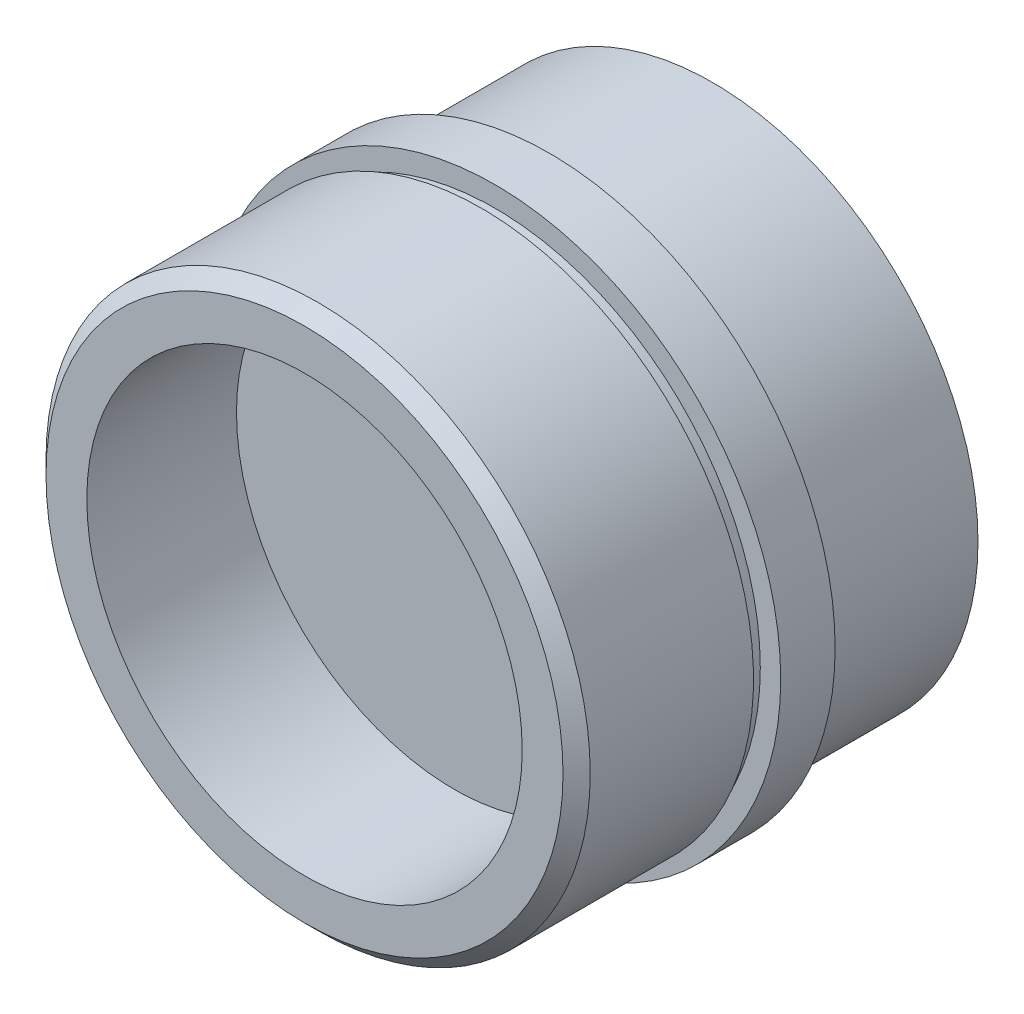
ISO-10303-21;
HEADER;
FILE_DESCRIPTION(('STEP AP214'),'2;1');
FILE_NAME('part.step','',(''),(''),'','','');
FILE_SCHEMA(('AUTOMOTIVE_DESIGN { 1 0 10303 214 1 1 1 1 }'));
ENDSEC;
DATA;
#1=APPLICATION_CONTEXT('core data for automotive mechanical design processes');
#2=APPLICATION_PROTOCOL_DEFINITION('international standard','automotive_design',2000,#1);
#3=PRODUCT_CONTEXT('',#1,'mechanical');
#4=PRODUCT('Part','Part','',(#3));
#5=PRODUCT_RELATED_PRODUCT_CATEGORY('part','',(#4));
#6=PRODUCT_DEFINITION_FORMATION('','',#4);
#7=PRODUCT_DEFINITION_CONTEXT('part definition',#1,'design');
#8=PRODUCT_DEFINITION('design','',#6,#7);
#9=PRODUCT_DEFINITION_SHAPE('','',#8);
#10=(LENGTH_UNIT() NAMED_UNIT(*) SI_UNIT(.MILLI.,.METRE.));
#11=(NAMED_UNIT(*) PLANE_ANGLE_UNIT() SI_UNIT($,.RADIAN.));
#12=(NAMED_UNIT(*) SI_UNIT($,.STERADIAN.) SOLID_ANGLE_UNIT());
#13=UNCERTAINTY_MEASURE_WITH_UNIT(LENGTH_MEASURE(1.E-05),#10,'distance_accuracy_value','');
#14=(GEOMETRIC_REPRESENTATION_CONTEXT(3) GLOBAL_UNCERTAINTY_ASSIGNED_CONTEXT((#13)) GLOBAL_UNIT_ASSIGNED_CONTEXT((#10,
#11,#12)) REPRESENTATION_CONTEXT('',''));
#15=CARTESIAN_POINT('',(0.,0.,0.));
#16=DIRECTION('',(0.,0.,1.));
#17=DIRECTION('',(1.,0.,0.));
#18=AXIS2_PLACEMENT_3D('',#15,#16,#17);
#19=CARTESIAN_POINT('',(0.,0.,16.));
#20=DIRECTION('',(0.,0.,1.));
#21=DIRECTION('',(1.,0.,0.));
#22=AXIS2_PLACEMENT_3D('',#19,#20,#21);
#23=PLANE('',#22);
#24=CARTESIAN_POINT('',(0.,0.,16.));
#25=DIRECTION('',(0.,0.,1.));
#26=DIRECTION('',(1.,0.,0.));
#27=AXIS2_PLACEMENT_3D('',#24,#25,#26);
#28=CIRCLE('',#27,21.);
#29=CARTESIAN_POINT('',(21.,0.,16.));
#30=VERTEX_POINT('',#29);
#31=EDGE_CURVE('E61',#30,#30,#28,.T.);
#32=ORIENTED_EDGE('',*,*,#31,.T.);
#33=EDGE_LOOP('',(#32));
#34=FACE_BOUND('',#33,.T.);
#35=CARTESIAN_POINT('',(0.,0.,16.));
#36=DIRECTION('',(0.,0.,-1.));
#37=DIRECTION('',(-1.,0.,0.));
#38=AXIS2_PLACEMENT_3D('',#35,#36,#37);
#39=CIRCLE('',#38,19.5);
#40=CARTESIAN_POINT('',(-19.5,0.,16.));
#41=VERTEX_POINT('',#40);
#42=EDGE_CURVE('E74',#41,#41,#39,.T.);
#43=ORIENTED_EDGE('',*,*,#42,.T.);
#44=EDGE_LOOP('',(#43));
#45=FACE_BOUND('',#44,.T.);
#46=ADVANCED_FACE('F30',(#34,#45),#23,.T.);
#47=CARTESIAN_POINT('',(0.,0.,0.));
#48=DIRECTION('',(0.,0.,1.));
#49=DIRECTION('',(1.,0.,0.));
#50=AXIS2_PLACEMENT_3D('',#47,#48,#49);
#51=PLANE('',#50);
#52=CARTESIAN_POINT('',(0.,0.,0.));
#53=DIRECTION('',(0.,0.,1.));
#54=DIRECTION('',(1.,0.,0.));
#55=AXIS2_PLACEMENT_3D('',#52,#53,#54);
#56=CIRCLE('',#55,19.5);
#57=CARTESIAN_POINT('',(19.5,0.,0.));
#58=VERTEX_POINT('',#57);
#59=EDGE_CURVE('E55',#58,#58,#56,.T.);
#60=ORIENTED_EDGE('',*,*,#59,.F.);
#61=EDGE_LOOP('',(#60));
#62=FACE_BOUND('',#61,.T.);
#63=CARTESIAN_POINT('',(0.,0.,0.));
#64=DIRECTION('',(0.,0.,1.));
#65=DIRECTION('',(1.,0.,0.));
#66=AXIS2_PLACEMENT_3D('',#63,#64,#65);
#67=CIRCLE('',#66,16.);
#68=CARTESIAN_POINT('',(16.,0.,0.));
#69=VERTEX_POINT('',#68);
#70=EDGE_CURVE('E58',#69,#69,#67,.T.);
#71=ORIENTED_EDGE('',*,*,#70,.T.);
#72=EDGE_LOOP('',(#71));
#73=FACE_BOUND('',#72,.T.);
#74=ADVANCED_FACE('F106',(#62,#73),#51,.F.);
#75=CARTESIAN_POINT('',(0.,0.,12.));
#76=DIRECTION('',(0.,0.,-1.));
#77=DIRECTION('',(-1.,0.,0.));
#78=AXIS2_PLACEMENT_3D('',#75,#76,#77);
#79=CYLINDRICAL_SURFACE('',#78,19.5);
#80=CARTESIAN_POINT('',(0.,0.,12.));
#81=DIRECTION('',(0.,0.,1.));
#82=DIRECTION('',(1.,0.,0.));
#83=AXIS2_PLACEMENT_3D('',#80,#81,#82);
#84=CIRCLE('',#83,19.5);
#85=CARTESIAN_POINT('',(19.5,0.,12.));
#86=VERTEX_POINT('',#85);
#87=EDGE_CURVE('E45',#86,#86,#84,.T.);
#88=ORIENTED_EDGE('',*,*,#87,.F.);
#89=EDGE_LOOP('',(#88));
#90=FACE_BOUND('',#89,.T.);
#91=ORIENTED_EDGE('',*,*,#59,.T.);
#92=EDGE_LOOP('',(#91));
#93=FACE_BOUND('',#92,.T.);
#94=ADVANCED_FACE('F32',(#90,#93),#79,.T.);
#95=CARTESIAN_POINT('',(0.,0.,12.));
#96=DIRECTION('',(0.,0.,-1.));
#97=DIRECTION('',(-1.,0.,0.));
#98=AXIS2_PLACEMENT_3D('',#95,#96,#97);
#99=CYLINDRICAL_SURFACE('',#98,16.);
#100=ORIENTED_EDGE('',*,*,#70,.F.);
#101=EDGE_LOOP('',(#100));
#102=FACE_BOUND('',#101,.T.);
#103=CARTESIAN_POINT('',(0.,0.,16.));
#104=DIRECTION('',(0.,0.,1.));
#105=DIRECTION('',(1.,0.,0.));
#106=AXIS2_PLACEMENT_3D('',#103,#104,#105);
#107=CIRCLE('',#106,16.);
#108=CARTESIAN_POINT('',(16.,0.,16.));
#109=VERTEX_POINT('',#108);
#110=EDGE_CURVE('E50',#109,#109,#107,.T.);
#111=ORIENTED_EDGE('',*,*,#110,.T.);
#112=EDGE_LOOP('',(#111));
#113=FACE_BOUND('',#112,.T.);
#114=ADVANCED_FACE('F119',(#102,#113),#99,.F.);
#115=CARTESIAN_POINT('',(0.,0.,12.));
#116=DIRECTION('',(0.,0.,1.));
#117=DIRECTION('',(1.,0.,0.));
#118=AXIS2_PLACEMENT_3D('',#115,#116,#117);
#119=PLANE('',#118);
#120=CARTESIAN_POINT('',(0.,0.,12.));
#121=DIRECTION('',(0.,0.,1.));
#122=DIRECTION('',(1.,0.,0.));
#123=AXIS2_PLACEMENT_3D('',#120,#121,#122);
#124=CIRCLE('',#123,21.);
#125=CARTESIAN_POINT('',(21.,0.,12.));
#126=VERTEX_POINT('',#125);
#127=EDGE_CURVE('E64',#126,#126,#124,.T.);
#128=ORIENTED_EDGE('',*,*,#127,.F.);
#129=EDGE_LOOP('',(#128));
#130=FACE_BOUND('',#129,.T.);
#131=ORIENTED_EDGE('',*,*,#87,.T.);
#132=EDGE_LOOP('',(#131));
#133=FACE_BOUND('',#132,.T.);
#134=ADVANCED_FACE('F114',(#130,#133),#119,.F.);
#135=CARTESIAN_POINT('',(0.,0.,16.));
#136=DIRECTION('',(0.,0.,-1.));
#137=DIRECTION('',(-1.,0.,0.));
#138=AXIS2_PLACEMENT_3D('',#135,#136,#137);
#139=CYLINDRICAL_SURFACE('',#138,21.);
#140=ORIENTED_EDGE('',*,*,#31,.F.);
#141=EDGE_LOOP('',(#140));
#142=FACE_BOUND('',#141,.T.);
#143=ORIENTED_EDGE('',*,*,#127,.T.);
#144=EDGE_LOOP('',(#143));
#145=FACE_BOUND('',#144,.T.);
#146=ADVANCED_FACE('F115',(#142,#145),#139,.T.);
#147=CARTESIAN_POINT('',(0.,0.,16.));
#148=DIRECTION('',(0.,0.,1.));
#149=DIRECTION('',(1.,0.,0.));
#150=AXIS2_PLACEMENT_3D('',#147,#148,#149);
#151=PLANE('',#150);
#152=ORIENTED_EDGE('',*,*,#110,.F.);
#153=EDGE_LOOP('',(#152));
#154=FACE_BOUND('',#153,.T.);
#155=ADVANCED_FACE('F89',(#154),#151,.F.);
#156=CARTESIAN_POINT('',(-20.,0.,17.));
#157=DIRECTION('',(0.,0.,1.));
#158=DIRECTION('',(1.,0.,0.));
#159=AXIS2_PLACEMENT_3D('',#156,#157,#158);
#160=PLANE('',#159);
#161=CARTESIAN_POINT('',(0.,0.,17.));
#162=DIRECTION('',(0.,0.,-1.));
#163=DIRECTION('',(-1.,0.,0.));
#164=AXIS2_PLACEMENT_3D('',#161,#162,#163);
#165=CIRCLE('',#164,19.5);
#166=CARTESIAN_POINT('',(-19.5,0.,17.));
#167=VERTEX_POINT('',#166);
#168=EDGE_CURVE('E71',#167,#167,#165,.T.);
#169=ORIENTED_EDGE('',*,*,#168,.F.);
#170=EDGE_LOOP('',(#169));
#171=FACE_BOUND('',#170,.T.);
#172=CARTESIAN_POINT('',(0.,0.,17.));
#173=DIRECTION('',(0.,0.,-1.));
#174=DIRECTION('',(-1.,0.,0.));
#175=AXIS2_PLACEMENT_3D('',#172,#173,#174);
#176=CIRCLE('',#175,20.);
#177=CARTESIAN_POINT('',(-20.,0.,17.));
#178=VERTEX_POINT('',#177);
#179=EDGE_CURVE('E51',#178,#178,#176,.T.);
#180=ORIENTED_EDGE('',*,*,#179,.T.);
#181=EDGE_LOOP('',(#180));
#182=FACE_BOUND('',#181,.T.);
#183=ADVANCED_FACE('F83',(#171,#182),#160,.F.);
#184=CARTESIAN_POINT('',(0.,0.,0.));
#185=DIRECTION('',(0.,0.,-1.));
#186=DIRECTION('',(-1.,0.,0.));
#187=AXIS2_PLACEMENT_3D('',#184,#185,#186);
#188=CYLINDRICAL_SURFACE('',#187,19.5);
#189=ORIENTED_EDGE('',*,*,#42,.F.);
#190=EDGE_LOOP('',(#189));
#191=FACE_BOUND('',#190,.T.);
#192=ORIENTED_EDGE('',*,*,#168,.T.);
#193=EDGE_LOOP('',(#192));
#194=FACE_BOUND('',#193,.T.);
#195=ADVANCED_FACE('F79',(#191,#194),#188,.T.);
#196=CARTESIAN_POINT('',(0.,0.,19.));
#197=DIRECTION('',(0.,0.,1.));
#198=DIRECTION('',(1.,0.,0.));
#199=AXIS2_PLACEMENT_3D('',#196,#197,#198);
#200=PLANE('',#199);
#201=CARTESIAN_POINT('',(0.,0.,19.));
#202=DIRECTION('',(0.,0.,1.));
#203=DIRECTION('',(1.,0.,0.));
#204=AXIS2_PLACEMENT_3D('',#201,#202,#203);
#205=CIRCLE('',#204,16.);
#206=CARTESIAN_POINT('',(16.,0.,19.));
#207=VERTEX_POINT('',#206);
#208=EDGE_CURVE('E41',#207,#207,#205,.F.);
#209=ORIENTED_EDGE('',*,*,#208,.F.);
#210=EDGE_LOOP('',(#209));
#211=FACE_BOUND('',#210,.T.);
#212=ADVANCED_FACE('F82',(#211),#200,.T.);
#213=CARTESIAN_POINT('',(0.,0.,33.));
#214=DIRECTION('',(0.,0.,-1.));
#215=DIRECTION('',(-1.,0.,0.));
#216=AXIS2_PLACEMENT_3D('',#213,#214,#215);
#217=CYLINDRICAL_SURFACE('',#216,16.);
#218=ORIENTED_EDGE('',*,*,#208,.T.);
#219=EDGE_LOOP('',(#218));
#220=FACE_BOUND('',#219,.T.);
#221=CARTESIAN_POINT('',(0.,0.,30.));
#222=DIRECTION('',(0.,0.,1.));
#223=DIRECTION('',(1.,0.,0.));
#224=AXIS2_PLACEMENT_3D('',#221,#222,#223);
#225=CIRCLE('',#224,16.);
#226=CARTESIAN_POINT('',(16.,0.,30.));
#227=VERTEX_POINT('',#226);
#228=EDGE_CURVE('E48',#227,#227,#225,.T.);
#229=ORIENTED_EDGE('',*,*,#228,.T.);
#230=EDGE_LOOP('',(#229));
#231=FACE_BOUND('',#230,.T.);
#232=ADVANCED_FACE('F137',(#220,#231),#217,.F.);
#233=CARTESIAN_POINT('',(0.,0.,30.));
#234=DIRECTION('',(0.,0.,1.));
#235=DIRECTION('',(1.,0.,0.));
#236=AXIS2_PLACEMENT_3D('',#233,#234,#235);
#237=PLANE('',#236);
#238=CARTESIAN_POINT('',(0.,0.,30.));
#239=DIRECTION('',(0.,0.,1.));
#240=DIRECTION('',(1.,0.,0.));
#241=AXIS2_PLACEMENT_3D('',#238,#239,#240);
#242=CIRCLE('',#241,19.);
#243=CARTESIAN_POINT('',(19.,0.,30.));
#244=VERTEX_POINT('',#243);
#245=EDGE_CURVE('E37',#244,#244,#242,.T.);
#246=ORIENTED_EDGE('',*,*,#245,.T.);
#247=EDGE_LOOP('',(#246));
#248=FACE_BOUND('',#247,.T.);
#249=ORIENTED_EDGE('',*,*,#228,.F.);
#250=EDGE_LOOP('',(#249));
#251=FACE_BOUND('',#250,.T.);
#252=ADVANCED_FACE('F100',(#248,#251),#237,.T.);
#253=CARTESIAN_POINT('',(0.,0.,30.));
#254=DIRECTION('',(0.,0.,-1.));
#255=DIRECTION('',(-1.,0.,0.));
#256=AXIS2_PLACEMENT_3D('',#253,#254,#255);
#257=CONICAL_SURFACE('',#256,19.,0.785398163397448);
#258=CARTESIAN_POINT('',(0.,0.,29.));
#259=DIRECTION('',(0.,0.,1.));
#260=DIRECTION('',(1.,0.,0.));
#261=AXIS2_PLACEMENT_3D('',#258,#259,#260);
#262=CIRCLE('',#261,20.);
#263=CARTESIAN_POINT('',(20.,0.,29.));
#264=VERTEX_POINT('',#263);
#265=EDGE_CURVE('E10',#264,#264,#262,.F.);
#266=ORIENTED_EDGE('',*,*,#265,.F.);
#267=EDGE_LOOP('',(#266));
#268=FACE_BOUND('',#267,.T.);
#269=ORIENTED_EDGE('',*,*,#245,.F.);
#270=EDGE_LOOP('',(#269));
#271=FACE_BOUND('',#270,.T.);
#272=ADVANCED_FACE('F95',(#268,#271),#257,.T.);
#273=CARTESIAN_POINT('',(0.,0.,19.));
#274=DIRECTION('',(0.,0.,-1.));
#275=DIRECTION('',(-1.,0.,0.));
#276=AXIS2_PLACEMENT_3D('',#273,#274,#275);
#277=CYLINDRICAL_SURFACE('',#276,20.);
#278=ORIENTED_EDGE('',*,*,#179,.F.);
#279=EDGE_LOOP('',(#278));
#280=FACE_BOUND('',#279,.T.);
#281=ORIENTED_EDGE('',*,*,#265,.T.);
#282=EDGE_LOOP('',(#281));
#283=FACE_BOUND('',#282,.T.);
#284=ADVANCED_FACE('F93',(#280,#283),#277,.T.);
#285=CLOSED_SHELL('',(#46,#74,#94,#114,#134,#146,#155,#183,#195,#212,#232,#252,#272,#284));
#286=MANIFOLD_SOLID_BREP('B2',#285);
#287=ADVANCED_BREP_SHAPE_REPRESENTATION('',(#18,#286),#14);
#288=SHAPE_DEFINITION_REPRESENTATION(#9,#287);
ENDSEC;
END-ISO-10303-21;
